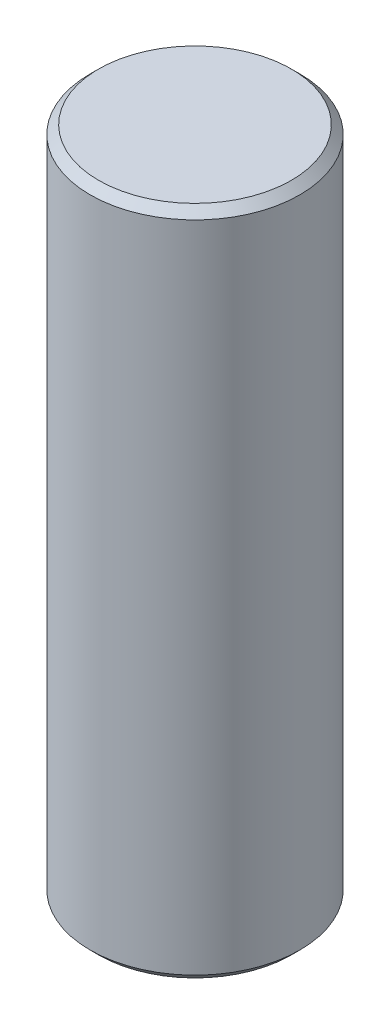
ISO-10303-21;
HEADER;
FILE_DESCRIPTION(('STEP AP214'),'2;1');
FILE_NAME('part.step','',(''),(''),'','','');
FILE_SCHEMA(('AUTOMOTIVE_DESIGN { 1 0 10303 214 1 1 1 1 }'));
ENDSEC;
DATA;
#1=APPLICATION_CONTEXT('core data for automotive mechanical design processes');
#2=APPLICATION_PROTOCOL_DEFINITION('international standard','automotive_design',2000,#1);
#3=PRODUCT_CONTEXT('',#1,'mechanical');
#4=PRODUCT('Part','Part','',(#3));
#5=PRODUCT_RELATED_PRODUCT_CATEGORY('part','',(#4));
#6=PRODUCT_DEFINITION_FORMATION('','',#4);
#7=PRODUCT_DEFINITION_CONTEXT('part definition',#1,'design');
#8=PRODUCT_DEFINITION('design','',#6,#7);
#9=PRODUCT_DEFINITION_SHAPE('','',#8);
#10=(LENGTH_UNIT() NAMED_UNIT(*) SI_UNIT(.MILLI.,.METRE.));
#11=(NAMED_UNIT(*) PLANE_ANGLE_UNIT() SI_UNIT($,.RADIAN.));
#12=(NAMED_UNIT(*) SI_UNIT($,.STERADIAN.) SOLID_ANGLE_UNIT());
#13=UNCERTAINTY_MEASURE_WITH_UNIT(LENGTH_MEASURE(1.E-05),#10,'distance_accuracy_value','');
#14=(GEOMETRIC_REPRESENTATION_CONTEXT(3) GLOBAL_UNCERTAINTY_ASSIGNED_CONTEXT((#13)) GLOBAL_UNIT_ASSIGNED_CONTEXT((#10,
#11,#12)) REPRESENTATION_CONTEXT('',''));
#15=CARTESIAN_POINT('',(0.,0.,0.));
#16=DIRECTION('',(0.,0.,1.));
#17=DIRECTION('',(1.,0.,0.));
#18=AXIS2_PLACEMENT_3D('',#15,#16,#17);
#19=CARTESIAN_POINT('',(0.,16.,0.));
#20=DIRECTION('',(0.,-1.,0.));
#21=DIRECTION('',(0.,0.,-1.));
#22=AXIS2_PLACEMENT_3D('',#19,#20,#21);
#23=CYLINDRICAL_SURFACE('',#22,2.5);
#24=CARTESIAN_POINT('',(0.,0.199999999999999,0.));
#25=DIRECTION('',(0.,1.,0.));
#26=DIRECTION('',(0.,0.,1.));
#27=AXIS2_PLACEMENT_3D('',#24,#25,#26);
#28=CIRCLE('',#27,2.5);
#29=CARTESIAN_POINT('',(0.,0.199999999999999,2.5));
#30=VERTEX_POINT('',#29);
#31=EDGE_CURVE('E44',#30,#30,#28,.T.);
#32=ORIENTED_EDGE('',*,*,#31,.T.);
#33=EDGE_LOOP('',(#32));
#34=FACE_BOUND('',#33,.T.);
#35=CARTESIAN_POINT('',(0.,15.8,0.));
#36=DIRECTION('',(0.,1.,0.));
#37=DIRECTION('',(0.,0.,1.));
#38=AXIS2_PLACEMENT_3D('',#35,#36,#37);
#39=CIRCLE('',#38,2.5);
#40=CARTESIAN_POINT('',(0.,15.8,2.5));
#41=VERTEX_POINT('',#40);
#42=EDGE_CURVE('E48',#41,#41,#39,.F.);
#43=ORIENTED_EDGE('',*,*,#42,.T.);
#44=EDGE_LOOP('',(#43));
#45=FACE_BOUND('',#44,.T.);
#46=ADVANCED_FACE('F32',(#34,#45),#23,.T.);
#47=CARTESIAN_POINT('',(0.,16.,0.));
#48=DIRECTION('',(0.,1.,0.));
#49=DIRECTION('',(0.,0.,1.));
#50=AXIS2_PLACEMENT_3D('',#47,#48,#49);
#51=PLANE('',#50);
#52=CARTESIAN_POINT('',(0.,16.,0.));
#53=DIRECTION('',(0.,1.,0.));
#54=DIRECTION('',(0.,0.,1.));
#55=AXIS2_PLACEMENT_3D('',#52,#53,#54);
#56=CIRCLE('',#55,2.30000000000001);
#57=CARTESIAN_POINT('',(0.,16.,2.30000000000001));
#58=VERTEX_POINT('',#57);
#59=EDGE_CURVE('E10',#58,#58,#56,.T.);
#60=ORIENTED_EDGE('',*,*,#59,.T.);
#61=EDGE_LOOP('',(#60));
#62=FACE_BOUND('',#61,.T.);
#63=ADVANCED_FACE('F64',(#62),#51,.T.);
#64=CARTESIAN_POINT('',(0.,0.,0.));
#65=DIRECTION('',(0.,1.,0.));
#66=DIRECTION('',(0.,0.,1.));
#67=AXIS2_PLACEMENT_3D('',#64,#65,#66);
#68=PLANE('',#67);
#69=CARTESIAN_POINT('',(0.,0.,0.));
#70=DIRECTION('',(0.,1.,0.));
#71=DIRECTION('',(0.,0.,1.));
#72=AXIS2_PLACEMENT_3D('',#69,#70,#71);
#73=CIRCLE('',#72,2.3);
#74=CARTESIAN_POINT('',(0.,0.,2.3));
#75=VERTEX_POINT('',#74);
#76=EDGE_CURVE('E40',#75,#75,#73,.F.);
#77=ORIENTED_EDGE('',*,*,#76,.T.);
#78=EDGE_LOOP('',(#77));
#79=FACE_BOUND('',#78,.T.);
#80=ADVANCED_FACE('F61',(#79),#68,.F.);
#81=CARTESIAN_POINT('',(0.,0.199999999999999,0.));
#82=DIRECTION('',(0.,1.,0.));
#83=DIRECTION('',(0.,0.,1.));
#84=AXIS2_PLACEMENT_3D('',#81,#82,#83);
#85=CONICAL_SURFACE('',#84,2.5,0.785398163397452);
#86=ORIENTED_EDGE('',*,*,#76,.F.);
#87=EDGE_LOOP('',(#86));
#88=FACE_BOUND('',#87,.T.);
#89=ORIENTED_EDGE('',*,*,#31,.F.);
#90=EDGE_LOOP('',(#89));
#91=FACE_BOUND('',#90,.T.);
#92=ADVANCED_FACE('F57',(#88,#91),#85,.T.);
#93=CARTESIAN_POINT('',(0.,16.,0.));
#94=DIRECTION('',(0.,-1.,0.));
#95=DIRECTION('',(0.,0.,-1.));
#96=AXIS2_PLACEMENT_3D('',#93,#94,#95);
#97=CONICAL_SURFACE('',#96,2.30000000000001,0.785398163397447);
#98=ORIENTED_EDGE('',*,*,#42,.F.);
#99=EDGE_LOOP('',(#98));
#100=FACE_BOUND('',#99,.T.);
#101=ORIENTED_EDGE('',*,*,#59,.F.);
#102=EDGE_LOOP('',(#101));
#103=FACE_BOUND('',#102,.T.);
#104=ADVANCED_FACE('F35',(#100,#103),#97,.T.);
#105=CLOSED_SHELL('',(#46,#63,#80,#92,#104));
#106=MANIFOLD_SOLID_BREP('B2',#105);
#107=ADVANCED_BREP_SHAPE_REPRESENTATION('',(#18,#106),#14);
#108=SHAPE_DEFINITION_REPRESENTATION(#9,#107);
ENDSEC;
END-ISO-10303-21;
